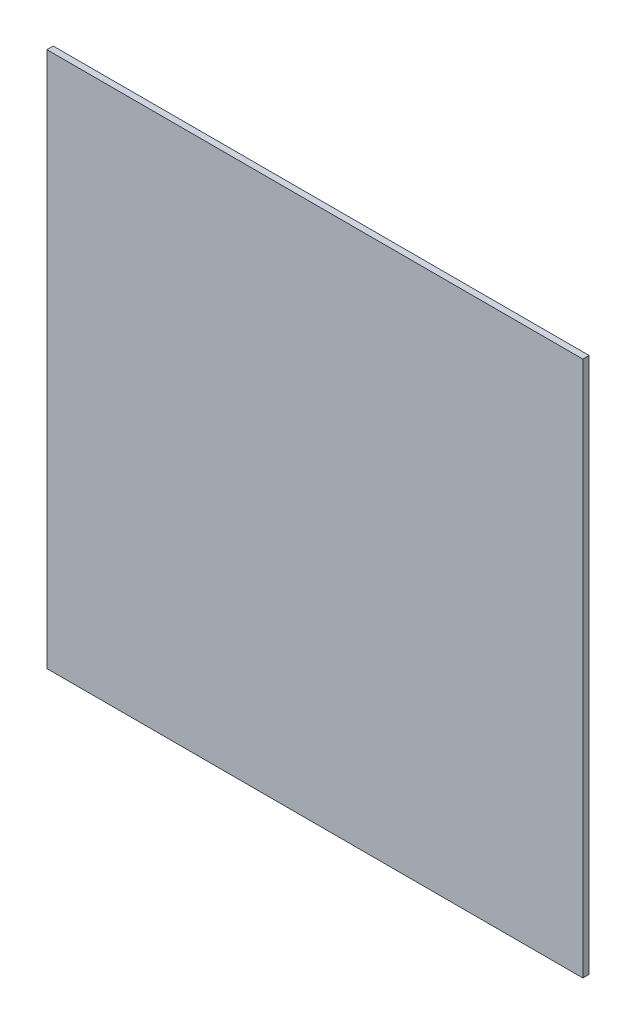
ISO-10303-21;
HEADER;
FILE_DESCRIPTION(('STEP AP214'),'2;1');
FILE_NAME('part.step','',(''),(''),'','','');
FILE_SCHEMA(('AUTOMOTIVE_DESIGN { 1 0 10303 214 1 1 1 1 }'));
ENDSEC;
DATA;
#1=APPLICATION_CONTEXT('core data for automotive mechanical design processes');
#2=APPLICATION_PROTOCOL_DEFINITION('international standard','automotive_design',2000,#1);
#3=PRODUCT_CONTEXT('',#1,'mechanical');
#4=PRODUCT('Part','Part','',(#3));
#5=PRODUCT_RELATED_PRODUCT_CATEGORY('part','',(#4));
#6=PRODUCT_DEFINITION_FORMATION('','',#4);
#7=PRODUCT_DEFINITION_CONTEXT('part definition',#1,'design');
#8=PRODUCT_DEFINITION('design','',#6,#7);
#9=PRODUCT_DEFINITION_SHAPE('','',#8);
#10=(LENGTH_UNIT() NAMED_UNIT(*) SI_UNIT(.MILLI.,.METRE.));
#11=(NAMED_UNIT(*) PLANE_ANGLE_UNIT() SI_UNIT($,.RADIAN.));
#12=(NAMED_UNIT(*) SI_UNIT($,.STERADIAN.) SOLID_ANGLE_UNIT());
#13=UNCERTAINTY_MEASURE_WITH_UNIT(LENGTH_MEASURE(1.E-05),#10,'distance_accuracy_value','');
#14=(GEOMETRIC_REPRESENTATION_CONTEXT(3) GLOBAL_UNCERTAINTY_ASSIGNED_CONTEXT((#13)) GLOBAL_UNIT_ASSIGNED_CONTEXT((#10,
#11,#12)) REPRESENTATION_CONTEXT('',''));
#15=CARTESIAN_POINT('',(0.,0.,0.));
#16=DIRECTION('',(0.,0.,1.));
#17=DIRECTION('',(1.,0.,0.));
#18=AXIS2_PLACEMENT_3D('',#15,#16,#17);
#19=CARTESIAN_POINT('',(-170.,170.,4.));
#20=DIRECTION('',(1.,0.,0.));
#21=DIRECTION('',(0.,1.,0.));
#22=AXIS2_PLACEMENT_3D('',#19,#20,#21);
#23=PLANE('',#22);
#24=DIRECTION('',(0.,-1.,0.));
#25=VECTOR('',#24,1.);
#26=CARTESIAN_POINT('',(-170.,170.,0.));
#27=LINE('',#26,#25);
#28=CARTESIAN_POINT('',(-170.,170.,0.));
#29=VERTEX_POINT('',#28);
#30=CARTESIAN_POINT('',(-170.,-170.,0.));
#31=VERTEX_POINT('',#30);
#32=EDGE_CURVE('E96',#29,#31,#27,.T.);
#33=ORIENTED_EDGE('',*,*,#32,.T.);
#34=DIRECTION('',(0.,0.,-1.));
#35=VECTOR('',#34,1.);
#36=CARTESIAN_POINT('',(-170.,-170.,4.));
#37=LINE('',#36,#35);
#38=CARTESIAN_POINT('',(-170.,-170.,4.));
#39=VERTEX_POINT('',#38);
#40=EDGE_CURVE('E11',#39,#31,#37,.T.);
#41=ORIENTED_EDGE('',*,*,#40,.F.);
#42=DIRECTION('',(0.,-1.,0.));
#43=VECTOR('',#42,1.);
#44=CARTESIAN_POINT('',(-170.,170.,4.));
#45=LINE('',#44,#43);
#46=CARTESIAN_POINT('',(-170.,170.,4.));
#47=VERTEX_POINT('',#46);
#48=EDGE_CURVE('E84',#47,#39,#45,.T.);
#49=ORIENTED_EDGE('',*,*,#48,.F.);
#50=DIRECTION('',(0.,0.,-1.));
#51=VECTOR('',#50,1.);
#52=CARTESIAN_POINT('',(-170.,170.,4.));
#53=LINE('',#52,#51);
#54=EDGE_CURVE('E92',#47,#29,#53,.T.);
#55=ORIENTED_EDGE('',*,*,#54,.T.);
#56=EDGE_LOOP('',(#33,#41,#49,#55));
#57=FACE_BOUND('',#56,.T.);
#58=ADVANCED_FACE('F33',(#57),#23,.F.);
#59=CARTESIAN_POINT('',(-170.,-170.,4.));
#60=DIRECTION('',(0.,1.,0.));
#61=DIRECTION('',(0.,0.,1.));
#62=AXIS2_PLACEMENT_3D('',#59,#60,#61);
#63=PLANE('',#62);
#64=DIRECTION('',(1.,0.,0.));
#65=VECTOR('',#64,1.);
#66=CARTESIAN_POINT('',(-170.,-170.,0.));
#67=LINE('',#66,#65);
#68=CARTESIAN_POINT('',(170.,-170.,0.));
#69=VERTEX_POINT('',#68);
#70=EDGE_CURVE('E88',#31,#69,#67,.T.);
#71=ORIENTED_EDGE('',*,*,#70,.T.);
#72=DIRECTION('',(0.,0.,-1.));
#73=VECTOR('',#72,1.);
#74=CARTESIAN_POINT('',(170.,-170.,4.));
#75=LINE('',#74,#73);
#76=CARTESIAN_POINT('',(170.,-170.,4.));
#77=VERTEX_POINT('',#76);
#78=EDGE_CURVE('E41',#77,#69,#75,.T.);
#79=ORIENTED_EDGE('',*,*,#78,.F.);
#80=DIRECTION('',(1.,0.,0.));
#81=VECTOR('',#80,1.);
#82=CARTESIAN_POINT('',(-170.,-170.,4.));
#83=LINE('',#82,#81);
#84=EDGE_CURVE('E79',#39,#77,#83,.T.);
#85=ORIENTED_EDGE('',*,*,#84,.F.);
#86=ORIENTED_EDGE('',*,*,#40,.T.);
#87=EDGE_LOOP('',(#71,#79,#85,#86));
#88=FACE_BOUND('',#87,.T.);
#89=ADVANCED_FACE('F87',(#88),#63,.F.);
#90=CARTESIAN_POINT('',(170.,170.,4.));
#91=DIRECTION('',(-1.,0.,0.));
#92=DIRECTION('',(0.,-1.,0.));
#93=AXIS2_PLACEMENT_3D('',#90,#91,#92);
#94=PLANE('',#93);
#95=DIRECTION('',(0.,1.,0.));
#96=VECTOR('',#95,1.);
#97=CARTESIAN_POINT('',(170.,170.,0.));
#98=LINE('',#97,#96);
#99=CARTESIAN_POINT('',(170.,170.,0.));
#100=VERTEX_POINT('',#99);
#101=EDGE_CURVE('E66',#69,#100,#98,.T.);
#102=ORIENTED_EDGE('',*,*,#101,.T.);
#103=DIRECTION('',(0.,0.,-1.));
#104=VECTOR('',#103,1.);
#105=CARTESIAN_POINT('',(170.,170.,4.));
#106=LINE('',#105,#104);
#107=CARTESIAN_POINT('',(170.,170.,4.));
#108=VERTEX_POINT('',#107);
#109=EDGE_CURVE('E89',#108,#100,#106,.T.);
#110=ORIENTED_EDGE('',*,*,#109,.F.);
#111=DIRECTION('',(0.,1.,0.));
#112=VECTOR('',#111,1.);
#113=CARTESIAN_POINT('',(170.,170.,4.));
#114=LINE('',#113,#112);
#115=EDGE_CURVE('E82',#77,#108,#114,.T.);
#116=ORIENTED_EDGE('',*,*,#115,.F.);
#117=ORIENTED_EDGE('',*,*,#78,.T.);
#118=EDGE_LOOP('',(#102,#110,#116,#117));
#119=FACE_BOUND('',#118,.T.);
#120=ADVANCED_FACE('F90',(#119),#94,.F.);
#121=CARTESIAN_POINT('',(-170.,170.,4.));
#122=DIRECTION('',(0.,-1.,0.));
#123=DIRECTION('',(0.,0.,-1.));
#124=AXIS2_PLACEMENT_3D('',#121,#122,#123);
#125=PLANE('',#124);
#126=DIRECTION('',(-1.,0.,0.));
#127=VECTOR('',#126,1.);
#128=CARTESIAN_POINT('',(-170.,170.,0.));
#129=LINE('',#128,#127);
#130=EDGE_CURVE('E72',#100,#29,#129,.T.);
#131=ORIENTED_EDGE('',*,*,#130,.T.);
#132=ORIENTED_EDGE('',*,*,#54,.F.);
#133=DIRECTION('',(-1.,0.,0.));
#134=VECTOR('',#133,1.);
#135=CARTESIAN_POINT('',(-170.,170.,4.));
#136=LINE('',#135,#134);
#137=EDGE_CURVE('E49',#108,#47,#136,.T.);
#138=ORIENTED_EDGE('',*,*,#137,.F.);
#139=ORIENTED_EDGE('',*,*,#109,.T.);
#140=EDGE_LOOP('',(#131,#132,#138,#139));
#141=FACE_BOUND('',#140,.T.);
#142=ADVANCED_FACE('F103',(#141),#125,.F.);
#143=CARTESIAN_POINT('',(0.,0.,4.));
#144=DIRECTION('',(0.,0.,1.));
#145=DIRECTION('',(1.,0.,0.));
#146=AXIS2_PLACEMENT_3D('',#143,#144,#145);
#147=PLANE('',#146);
#148=ORIENTED_EDGE('',*,*,#48,.T.);
#149=ORIENTED_EDGE('',*,*,#84,.T.);
#150=ORIENTED_EDGE('',*,*,#115,.T.);
#151=ORIENTED_EDGE('',*,*,#137,.T.);
#152=EDGE_LOOP('',(#148,#149,#150,#151));
#153=FACE_BOUND('',#152,.T.);
#154=ADVANCED_FACE('F80',(#153),#147,.T.);
#155=CARTESIAN_POINT('',(0.,0.,0.));
#156=DIRECTION('',(0.,0.,1.));
#157=DIRECTION('',(1.,0.,0.));
#158=AXIS2_PLACEMENT_3D('',#155,#156,#157);
#159=PLANE('',#158);
#160=ORIENTED_EDGE('',*,*,#32,.F.);
#161=ORIENTED_EDGE('',*,*,#130,.F.);
#162=ORIENTED_EDGE('',*,*,#101,.F.);
#163=ORIENTED_EDGE('',*,*,#70,.F.);
#164=EDGE_LOOP('',(#160,#161,#162,#163));
#165=FACE_BOUND('',#164,.T.);
#166=ADVANCED_FACE('F106',(#165),#159,.F.);
#167=CLOSED_SHELL('',(#58,#89,#120,#142,#154,#166));
#168=MANIFOLD_SOLID_BREP('B2',#167);
#169=ADVANCED_BREP_SHAPE_REPRESENTATION('',(#18,#168),#14);
#170=SHAPE_DEFINITION_REPRESENTATION(#9,#169);
ENDSEC;
END-ISO-10303-21;
